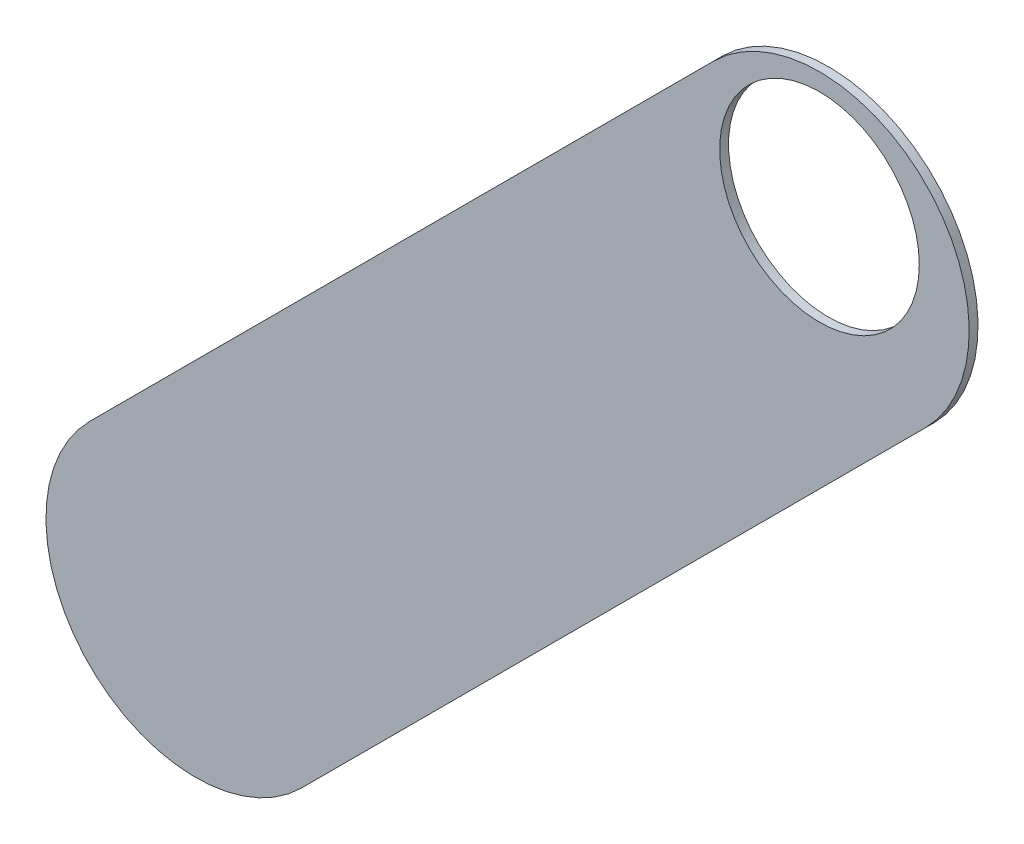
ISO-10303-21;
HEADER;
FILE_DESCRIPTION(('STEP AP214'),'2;1');
FILE_NAME('part.step','',(''),(''),'','','');
FILE_SCHEMA(('AUTOMOTIVE_DESIGN { 1 0 10303 214 1 1 1 1 }'));
ENDSEC;
DATA;
#1=APPLICATION_CONTEXT('core data for automotive mechanical design processes');
#2=APPLICATION_PROTOCOL_DEFINITION('international standard','automotive_design',2000,#1);
#3=PRODUCT_CONTEXT('',#1,'mechanical');
#4=PRODUCT('Part','Part','',(#3));
#5=PRODUCT_RELATED_PRODUCT_CATEGORY('part','',(#4));
#6=PRODUCT_DEFINITION_FORMATION('','',#4);
#7=PRODUCT_DEFINITION_CONTEXT('part definition',#1,'design');
#8=PRODUCT_DEFINITION('design','',#6,#7);
#9=PRODUCT_DEFINITION_SHAPE('','',#8);
#10=(LENGTH_UNIT() NAMED_UNIT(*) SI_UNIT(.MILLI.,.METRE.));
#11=(NAMED_UNIT(*) PLANE_ANGLE_UNIT() SI_UNIT($,.RADIAN.));
#12=(NAMED_UNIT(*) SI_UNIT($,.STERADIAN.) SOLID_ANGLE_UNIT());
#13=UNCERTAINTY_MEASURE_WITH_UNIT(LENGTH_MEASURE(1.E-05),#10,'distance_accuracy_value','');
#14=(GEOMETRIC_REPRESENTATION_CONTEXT(3) GLOBAL_UNCERTAINTY_ASSIGNED_CONTEXT((#13)) GLOBAL_UNIT_ASSIGNED_CONTEXT((#10,
#11,#12)) REPRESENTATION_CONTEXT('',''));
#15=CARTESIAN_POINT('',(0.,0.,0.));
#16=DIRECTION('',(0.,0.,1.));
#17=DIRECTION('',(1.,0.,0.));
#18=AXIS2_PLACEMENT_3D('',#15,#16,#17);
#19=CARTESIAN_POINT('',(72.3242648,84.98555774,0.));
#20=DIRECTION('',(-0.707106781186548,0.707106781186548,0.));
#21=DIRECTION('',(0.707106781186548,0.707106781186548,0.));
#22=AXIS2_PLACEMENT_3D('',#19,#20,#21);
#23=PLANE('',#22);
#24=DIRECTION('',(0.707106781186548,0.707106781186548,0.));
#25=VECTOR('',#24,1.);
#26=CARTESIAN_POINT('',(72.3242648,84.98555774,0.03556));
#27=LINE('',#26,#25);
#28=CARTESIAN_POINT('',(72.3242648,84.98555774,0.03556));
#29=VERTEX_POINT('',#28);
#30=CARTESIAN_POINT('',(74.82426742,87.48556036,0.03556));
#31=VERTEX_POINT('',#30);
#32=EDGE_CURVE('E11',#29,#31,#27,.T.);
#33=ORIENTED_EDGE('',*,*,#32,.F.);
#34=DIRECTION('',(0.,0.,1.));
#35=VECTOR('',#34,1.);
#36=CARTESIAN_POINT('',(72.3242648,84.98555774,0.));
#37=LINE('',#36,#35);
#38=CARTESIAN_POINT('',(72.3242648,84.98555774,0.));
#39=VERTEX_POINT('',#38);
#40=EDGE_CURVE('E24',#39,#29,#37,.T.);
#41=ORIENTED_EDGE('',*,*,#40,.F.);
#42=DIRECTION('',(0.707106781186548,0.707106781186548,0.));
#43=VECTOR('',#42,1.);
#44=CARTESIAN_POINT('',(72.3242648,84.98555774,0.));
#45=LINE('',#44,#43);
#46=CARTESIAN_POINT('',(74.82426742,87.48556036,0.));
#47=VERTEX_POINT('',#46);
#48=EDGE_CURVE('E96',#39,#47,#45,.T.);
#49=ORIENTED_EDGE('',*,*,#48,.T.);
#50=DIRECTION('',(0.,0.,1.));
#51=VECTOR('',#50,1.);
#52=CARTESIAN_POINT('',(74.82426742,87.48556036,0.));
#53=LINE('',#52,#51);
#54=EDGE_CURVE('E37',#47,#31,#53,.T.);
#55=ORIENTED_EDGE('',*,*,#54,.T.);
#56=EDGE_LOOP('',(#33,#41,#49,#55));
#57=FACE_BOUND('',#56,.T.);
#58=ADVANCED_FACE('F17',(#57),#23,.F.);
#59=CARTESIAN_POINT('',(71.90000098,85.40982156,0.));
#60=DIRECTION('',(0.,0.,-1.));
#61=DIRECTION('',(-0.707106781186536,0.707106781186559,0.));
#62=AXIS2_PLACEMENT_3D('',#59,#60,#61);
#63=CYLINDRICAL_SURFACE('',#62,0.599999648268215);
#64=CARTESIAN_POINT('',(71.90000098,85.40982156,0.03556));
#65=DIRECTION('',(0.,0.,1.));
#66=DIRECTION('',(-0.707106781186536,0.707106781186559,0.));
#67=AXIS2_PLACEMENT_3D('',#64,#65,#66);
#68=CIRCLE('',#67,0.599999648268215);
#69=CARTESIAN_POINT('',(71.47573716,85.83408538,0.03556));
#70=VERTEX_POINT('',#69);
#71=EDGE_CURVE('E92',#70,#29,#68,.T.);
#72=ORIENTED_EDGE('',*,*,#71,.F.);
#73=DIRECTION('',(0.,0.,1.));
#74=VECTOR('',#73,1.);
#75=CARTESIAN_POINT('',(71.47573716,85.83408538,0.));
#76=LINE('',#75,#74);
#77=CARTESIAN_POINT('',(71.47573716,85.83408538,0.));
#78=VERTEX_POINT('',#77);
#79=EDGE_CURVE('E90',#78,#70,#76,.T.);
#80=ORIENTED_EDGE('',*,*,#79,.F.);
#81=CARTESIAN_POINT('',(71.90000098,85.40982156,0.));
#82=DIRECTION('',(0.,0.,1.));
#83=DIRECTION('',(-0.707106781186536,0.707106781186559,0.));
#84=AXIS2_PLACEMENT_3D('',#81,#82,#83);
#85=CIRCLE('',#84,0.599999648268215);
#86=EDGE_CURVE('E88',#78,#39,#85,.T.);
#87=ORIENTED_EDGE('',*,*,#86,.T.);
#88=ORIENTED_EDGE('',*,*,#40,.T.);
#89=EDGE_LOOP('',(#72,#80,#87,#88));
#90=FACE_BOUND('',#89,.T.);
#91=ADVANCED_FACE('F111',(#90),#63,.T.);
#92=CARTESIAN_POINT('',(74.4000036,87.90982418,0.));
#93=DIRECTION('',(0.,0.,-1.));
#94=DIRECTION('',(0.707106781186559,-0.707106781186536,0.));
#95=AXIS2_PLACEMENT_3D('',#92,#93,#94);
#96=CYLINDRICAL_SURFACE('',#95,0.599999648268221);
#97=CARTESIAN_POINT('',(74.4000036,87.90982418,0.03556));
#98=DIRECTION('',(0.,0.,1.));
#99=DIRECTION('',(0.707106781186559,-0.707106781186536,0.));
#100=AXIS2_PLACEMENT_3D('',#97,#98,#99);
#101=CIRCLE('',#100,0.599999648268221);
#102=CARTESIAN_POINT('',(73.97573978,88.334088,0.03556));
#103=VERTEX_POINT('',#102);
#104=EDGE_CURVE('E85',#31,#103,#101,.T.);
#105=ORIENTED_EDGE('',*,*,#104,.F.);
#106=ORIENTED_EDGE('',*,*,#54,.F.);
#107=CARTESIAN_POINT('',(74.4000036,87.90982418,0.));
#108=DIRECTION('',(0.,0.,1.));
#109=DIRECTION('',(0.707106781186559,-0.707106781186536,0.));
#110=AXIS2_PLACEMENT_3D('',#107,#108,#109);
#111=CIRCLE('',#110,0.599999648268221);
#112=CARTESIAN_POINT('',(73.97573978,88.334088,0.));
#113=VERTEX_POINT('',#112);
#114=EDGE_CURVE('E82',#47,#113,#111,.T.);
#115=ORIENTED_EDGE('',*,*,#114,.T.);
#116=DIRECTION('',(0.,0.,1.));
#117=VECTOR('',#116,1.);
#118=CARTESIAN_POINT('',(73.97573978,88.334088,0.));
#119=LINE('',#118,#117);
#120=EDGE_CURVE('E80',#113,#103,#119,.T.);
#121=ORIENTED_EDGE('',*,*,#120,.T.);
#122=EDGE_LOOP('',(#105,#106,#115,#121));
#123=FACE_BOUND('',#122,.T.);
#124=ADVANCED_FACE('F104',(#123),#96,.T.);
#125=CARTESIAN_POINT('',(73.97573978,88.334088,0.));
#126=DIRECTION('',(0.707106781186548,-0.707106781186548,0.));
#127=DIRECTION('',(-0.707106781186548,-0.707106781186548,0.));
#128=AXIS2_PLACEMENT_3D('',#125,#126,#127);
#129=PLANE('',#128);
#130=DIRECTION('',(-0.707106781186548,-0.707106781186548,0.));
#131=VECTOR('',#130,1.);
#132=CARTESIAN_POINT('',(73.97573978,88.334088,0.03556));
#133=LINE('',#132,#131);
#134=EDGE_CURVE('E77',#103,#70,#133,.T.);
#135=ORIENTED_EDGE('',*,*,#134,.F.);
#136=ORIENTED_EDGE('',*,*,#120,.F.);
#137=DIRECTION('',(-0.707106781186548,-0.707106781186548,0.));
#138=VECTOR('',#137,1.);
#139=CARTESIAN_POINT('',(73.97573978,88.334088,0.));
#140=LINE('',#139,#138);
#141=EDGE_CURVE('E68',#113,#78,#140,.T.);
#142=ORIENTED_EDGE('',*,*,#141,.T.);
#143=ORIENTED_EDGE('',*,*,#79,.T.);
#144=EDGE_LOOP('',(#135,#136,#142,#143));
#145=FACE_BOUND('',#144,.T.);
#146=ADVANCED_FACE('F110',(#145),#129,.F.);
#147=CARTESIAN_POINT('',(74.4000036,88.0400068,0.));
#148=DIRECTION('',(0.,0.,-1.));
#149=DIRECTION('',(1.,0.,0.));
#150=AXIS2_PLACEMENT_3D('',#147,#148,#149);
#151=CYLINDRICAL_SURFACE('',#150,0.3999992);
#152=DIRECTION('',(0.,0.,1.));
#153=VECTOR('',#152,1.);
#154=CARTESIAN_POINT('',(74.8000028,88.0400068,0.));
#155=LINE('',#154,#153);
#156=CARTESIAN_POINT('',(74.8000028,88.0400068,0.));
#157=VERTEX_POINT('',#156);
#158=CARTESIAN_POINT('',(74.8000028,88.0400068,0.03556));
#159=VERTEX_POINT('',#158);
#160=EDGE_CURVE('E62',#157,#159,#155,.T.);
#161=ORIENTED_EDGE('',*,*,#160,.T.);
#162=CARTESIAN_POINT('',(74.4000036,88.0400068,0.03556));
#163=DIRECTION('',(0.,0.,1.));
#164=DIRECTION('',(1.,0.,0.));
#165=AXIS2_PLACEMENT_3D('',#162,#163,#164);
#166=CIRCLE('',#165,0.3999992);
#167=EDGE_CURVE('E67',#159,#159,#166,.T.);
#168=ORIENTED_EDGE('',*,*,#167,.T.);
#169=ORIENTED_EDGE('',*,*,#160,.F.);
#170=CARTESIAN_POINT('',(74.4000036,88.0400068,0.));
#171=DIRECTION('',(0.,0.,1.));
#172=DIRECTION('',(1.,0.,0.));
#173=AXIS2_PLACEMENT_3D('',#170,#171,#172);
#174=CIRCLE('',#173,0.3999992);
#175=EDGE_CURVE('E65',#157,#157,#174,.T.);
#176=ORIENTED_EDGE('',*,*,#175,.F.);
#177=EDGE_LOOP('',(#161,#168,#169,#176));
#178=FACE_BOUND('',#177,.T.);
#179=ADVANCED_FACE('F64',(#178),#151,.F.);
#180=CARTESIAN_POINT('',(72.3242648,84.98555774,0.));
#181=DIRECTION('',(0.,0.,-1.));
#182=DIRECTION('',(-1.,0.,0.));
#183=AXIS2_PLACEMENT_3D('',#180,#181,#182);
#184=PLANE('',#183);
#185=ORIENTED_EDGE('',*,*,#48,.F.);
#186=ORIENTED_EDGE('',*,*,#86,.F.);
#187=ORIENTED_EDGE('',*,*,#141,.F.);
#188=ORIENTED_EDGE('',*,*,#114,.F.);
#189=EDGE_LOOP('',(#185,#186,#187,#188));
#190=FACE_BOUND('',#189,.T.);
#191=ORIENTED_EDGE('',*,*,#175,.T.);
#192=EDGE_LOOP('',(#191));
#193=FACE_BOUND('',#192,.T.);
#194=ADVANCED_FACE('F71',(#190,#193),#184,.T.);
#195=CARTESIAN_POINT('',(72.3242648,84.98555774,0.03556));
#196=DIRECTION('',(0.,0.,-1.));
#197=DIRECTION('',(-1.,0.,0.));
#198=AXIS2_PLACEMENT_3D('',#195,#196,#197);
#199=PLANE('',#198);
#200=ORIENTED_EDGE('',*,*,#134,.T.);
#201=ORIENTED_EDGE('',*,*,#71,.T.);
#202=ORIENTED_EDGE('',*,*,#32,.T.);
#203=ORIENTED_EDGE('',*,*,#104,.T.);
#204=EDGE_LOOP('',(#200,#201,#202,#203));
#205=FACE_BOUND('',#204,.T.);
#206=ORIENTED_EDGE('',*,*,#167,.F.);
#207=EDGE_LOOP('',(#206));
#208=FACE_BOUND('',#207,.T.);
#209=ADVANCED_FACE('F107',(#205,#208),#199,.F.);
#210=CLOSED_SHELL('',(#58,#91,#124,#146,#179,#194,#209));
#211=MANIFOLD_SOLID_BREP('B1',#210);
#212=ADVANCED_BREP_SHAPE_REPRESENTATION('',(#18,#211),#14);
#213=SHAPE_DEFINITION_REPRESENTATION(#9,#212);
ENDSEC;
END-ISO-10303-21;
